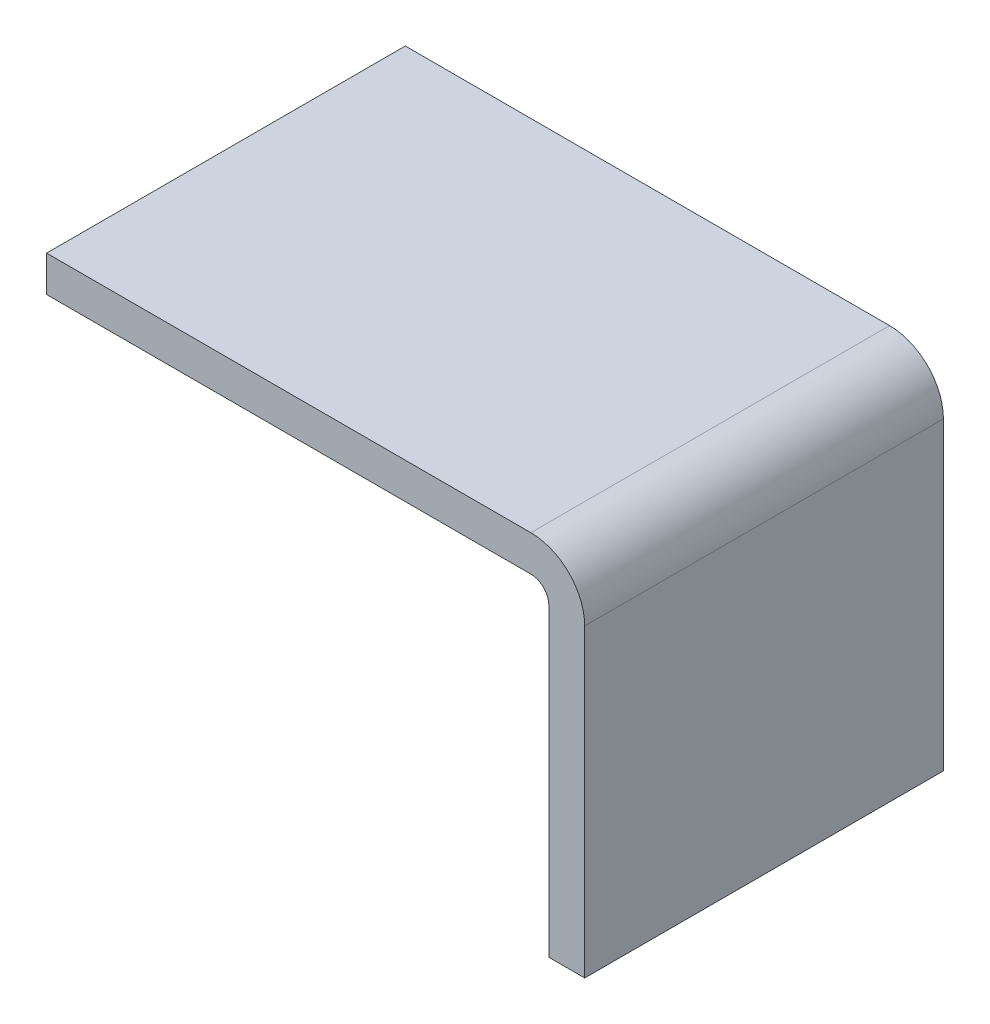
ISO-10303-21;
HEADER;
FILE_DESCRIPTION(('STEP AP214'),'2;1');
FILE_NAME('part.step','',(''),(''),'','','');
FILE_SCHEMA(('AUTOMOTIVE_DESIGN { 1 0 10303 214 1 1 1 1 }'));
ENDSEC;
DATA;
#1=APPLICATION_CONTEXT('core data for automotive mechanical design processes');
#2=APPLICATION_PROTOCOL_DEFINITION('international standard','automotive_design',2000,#1);
#3=PRODUCT_CONTEXT('',#1,'mechanical');
#4=PRODUCT('Part','Part','',(#3));
#5=PRODUCT_RELATED_PRODUCT_CATEGORY('part','',(#4));
#6=PRODUCT_DEFINITION_FORMATION('','',#4);
#7=PRODUCT_DEFINITION_CONTEXT('part definition',#1,'design');
#8=PRODUCT_DEFINITION('design','',#6,#7);
#9=PRODUCT_DEFINITION_SHAPE('','',#8);
#10=(LENGTH_UNIT() NAMED_UNIT(*) SI_UNIT(.MILLI.,.METRE.));
#11=(NAMED_UNIT(*) PLANE_ANGLE_UNIT() SI_UNIT($,.RADIAN.));
#12=(NAMED_UNIT(*) SI_UNIT($,.STERADIAN.) SOLID_ANGLE_UNIT());
#13=UNCERTAINTY_MEASURE_WITH_UNIT(LENGTH_MEASURE(1.E-05),#10,'distance_accuracy_value','');
#14=(GEOMETRIC_REPRESENTATION_CONTEXT(3) GLOBAL_UNCERTAINTY_ASSIGNED_CONTEXT((#13)) GLOBAL_UNIT_ASSIGNED_CONTEXT((#10,
#11,#12)) REPRESENTATION_CONTEXT('',''));
#15=CARTESIAN_POINT('',(0.,0.,0.));
#16=DIRECTION('',(0.,0.,1.));
#17=DIRECTION('',(1.,0.,0.));
#18=AXIS2_PLACEMENT_3D('',#15,#16,#17);
#19=CARTESIAN_POINT('',(0.,0.,0.));
#20=DIRECTION('',(1.,0.,0.));
#21=DIRECTION('',(0.,0.,-1.));
#22=AXIS2_PLACEMENT_3D('',#19,#20,#21);
#23=PLANE('',#22);
#24=DIRECTION('',(0.,0.,-1.));
#25=VECTOR('',#24,1.);
#26=CARTESIAN_POINT('',(0.,127.,-127.));
#27=LINE('',#26,#25);
#28=CARTESIAN_POINT('',(0.,127.,0.));
#29=VERTEX_POINT('',#28);
#30=CARTESIAN_POINT('',(0.,127.,-127.));
#31=VERTEX_POINT('',#30);
#32=EDGE_CURVE('E139',#29,#31,#27,.T.);
#33=ORIENTED_EDGE('',*,*,#32,.T.);
#34=DIRECTION('',(0.,-1.,0.));
#35=VECTOR('',#34,1.);
#36=CARTESIAN_POINT('',(0.,0.,-127.));
#37=LINE('',#36,#35);
#38=CARTESIAN_POINT('',(0.,114.3,-127.));
#39=VERTEX_POINT('',#38);
#40=EDGE_CURVE('E135',#31,#39,#37,.T.);
#41=ORIENTED_EDGE('',*,*,#40,.T.);
#42=DIRECTION('',(0.,0.,1.));
#43=VECTOR('',#42,1.);
#44=CARTESIAN_POINT('',(0.,114.3,-127.));
#45=LINE('',#44,#43);
#46=CARTESIAN_POINT('',(0.,114.3,0.));
#47=VERTEX_POINT('',#46);
#48=EDGE_CURVE('E108',#39,#47,#45,.T.);
#49=ORIENTED_EDGE('',*,*,#48,.T.);
#50=DIRECTION('',(0.,-1.,0.));
#51=VECTOR('',#50,1.);
#52=CARTESIAN_POINT('',(0.,0.,0.));
#53=LINE('',#52,#51);
#54=EDGE_CURVE('E116',#29,#47,#53,.T.);
#55=ORIENTED_EDGE('',*,*,#54,.F.);
#56=EDGE_LOOP('',(#33,#41,#49,#55));
#57=FACE_BOUND('',#56,.T.);
#58=ADVANCED_FACE('F39',(#57),#23,.F.);
#59=CARTESIAN_POINT('',(0.,0.,0.));
#60=DIRECTION('',(0.,1.,0.));
#61=DIRECTION('',(0.,0.,1.));
#62=AXIS2_PLACEMENT_3D('',#59,#60,#61);
#63=PLANE('',#62);
#64=DIRECTION('',(0.,0.,1.));
#65=VECTOR('',#64,1.);
#66=CARTESIAN_POINT('',(190.5,0.,-127.));
#67=LINE('',#66,#65);
#68=CARTESIAN_POINT('',(190.5,0.,-127.));
#69=VERTEX_POINT('',#68);
#70=CARTESIAN_POINT('',(190.5,0.,0.));
#71=VERTEX_POINT('',#70);
#72=EDGE_CURVE('E113',#69,#71,#67,.T.);
#73=ORIENTED_EDGE('',*,*,#72,.T.);
#74=DIRECTION('',(1.,0.,0.));
#75=VECTOR('',#74,1.);
#76=CARTESIAN_POINT('',(0.,0.,0.));
#77=LINE('',#76,#75);
#78=CARTESIAN_POINT('',(177.8,0.,0.));
#79=VERTEX_POINT('',#78);
#80=EDGE_CURVE('E110',#79,#71,#77,.T.);
#81=ORIENTED_EDGE('',*,*,#80,.F.);
#82=DIRECTION('',(0.,0.,-1.));
#83=VECTOR('',#82,1.);
#84=CARTESIAN_POINT('',(177.8,0.,-127.));
#85=LINE('',#84,#83);
#86=CARTESIAN_POINT('',(177.8,0.,-127.));
#87=VERTEX_POINT('',#86);
#88=EDGE_CURVE('E43',#79,#87,#85,.T.);
#89=ORIENTED_EDGE('',*,*,#88,.T.);
#90=DIRECTION('',(1.,0.,0.));
#91=VECTOR('',#90,1.);
#92=CARTESIAN_POINT('',(0.,0.,-127.));
#93=LINE('',#92,#91);
#94=EDGE_CURVE('E138',#87,#69,#93,.T.);
#95=ORIENTED_EDGE('',*,*,#94,.T.);
#96=EDGE_LOOP('',(#73,#81,#89,#95));
#97=FACE_BOUND('',#96,.T.);
#98=ADVANCED_FACE('F111',(#97),#63,.F.);
#99=CARTESIAN_POINT('',(171.45,107.95,-127.));
#100=DIRECTION('',(0.,0.,1.));
#101=DIRECTION('',(1.,0.,0.));
#102=AXIS2_PLACEMENT_3D('',#99,#100,#101);
#103=CYLINDRICAL_SURFACE('',#102,19.05);
#104=CARTESIAN_POINT('',(171.45,107.95,-127.));
#105=DIRECTION('',(0.,0.,-1.));
#106=DIRECTION('',(-1.,0.,0.));
#107=AXIS2_PLACEMENT_3D('',#104,#105,#106);
#108=CIRCLE('',#107,19.05);
#109=CARTESIAN_POINT('',(171.45,127.,-127.));
#110=VERTEX_POINT('',#109);
#111=CARTESIAN_POINT('',(190.5,107.95,-127.));
#112=VERTEX_POINT('',#111);
#113=EDGE_CURVE('E164',#110,#112,#108,.T.);
#114=ORIENTED_EDGE('',*,*,#113,.F.);
#115=DIRECTION('',(0.,0.,1.));
#116=VECTOR('',#115,1.);
#117=CARTESIAN_POINT('',(171.45,127.,-127.));
#118=LINE('',#117,#116);
#119=CARTESIAN_POINT('',(171.45,127.,0.));
#120=VERTEX_POINT('',#119);
#121=EDGE_CURVE('E115',#120,#110,#118,.F.);
#122=ORIENTED_EDGE('',*,*,#121,.F.);
#123=CARTESIAN_POINT('',(171.45,107.95,0.));
#124=DIRECTION('',(0.,0.,-1.));
#125=DIRECTION('',(-1.,0.,0.));
#126=AXIS2_PLACEMENT_3D('',#123,#124,#125);
#127=CIRCLE('',#126,19.05);
#128=CARTESIAN_POINT('',(190.5,107.95,0.));
#129=VERTEX_POINT('',#128);
#130=EDGE_CURVE('E148',#129,#120,#127,.F.);
#131=ORIENTED_EDGE('',*,*,#130,.F.);
#132=DIRECTION('',(0.,0.,1.));
#133=VECTOR('',#132,1.);
#134=CARTESIAN_POINT('',(190.5,107.95,-127.));
#135=LINE('',#134,#133);
#136=EDGE_CURVE('E168',#112,#129,#135,.T.);
#137=ORIENTED_EDGE('',*,*,#136,.F.);
#138=EDGE_LOOP('',(#114,#122,#131,#137));
#139=FACE_BOUND('',#138,.T.);
#140=ADVANCED_FACE('F171',(#139),#103,.T.);
#141=CARTESIAN_POINT('',(0.,0.,-127.));
#142=DIRECTION('',(0.,0.,-1.));
#143=DIRECTION('',(-1.,0.,0.));
#144=AXIS2_PLACEMENT_3D('',#141,#142,#143);
#145=PLANE('',#144);
#146=ORIENTED_EDGE('',*,*,#40,.F.);
#147=DIRECTION('',(-1.,0.,0.));
#148=VECTOR('',#147,1.);
#149=CARTESIAN_POINT('',(-190.5,127.,-127.));
#150=LINE('',#149,#148);
#151=EDGE_CURVE('E144',#110,#31,#150,.T.);
#152=ORIENTED_EDGE('',*,*,#151,.F.);
#153=ORIENTED_EDGE('',*,*,#113,.T.);
#154=DIRECTION('',(0.,1.,0.));
#155=VECTOR('',#154,1.);
#156=CARTESIAN_POINT('',(190.5,-127.,-127.));
#157=LINE('',#156,#155);
#158=EDGE_CURVE('E147',#69,#112,#157,.T.);
#159=ORIENTED_EDGE('',*,*,#158,.F.);
#160=ORIENTED_EDGE('',*,*,#94,.F.);
#161=DIRECTION('',(0.,-1.,0.));
#162=VECTOR('',#161,1.);
#163=CARTESIAN_POINT('',(177.8,107.95,-127.));
#164=LINE('',#163,#162);
#165=CARTESIAN_POINT('',(177.8,107.95,-127.));
#166=VERTEX_POINT('',#165);
#167=EDGE_CURVE('E106',#166,#87,#164,.T.);
#168=ORIENTED_EDGE('',*,*,#167,.F.);
#169=CARTESIAN_POINT('',(171.45,107.95,-127.));
#170=DIRECTION('',(0.,0.,-1.));
#171=DIRECTION('',(-1.,0.,0.));
#172=AXIS2_PLACEMENT_3D('',#169,#170,#171);
#173=CIRCLE('',#172,6.35000000000002);
#174=CARTESIAN_POINT('',(171.45,114.3,-127.));
#175=VERTEX_POINT('',#174);
#176=EDGE_CURVE('E125',#175,#166,#173,.T.);
#177=ORIENTED_EDGE('',*,*,#176,.F.);
#178=DIRECTION('',(1.,0.,0.));
#179=VECTOR('',#178,1.);
#180=CARTESIAN_POINT('',(-158.75,114.3,-127.));
#181=LINE('',#180,#179);
#182=EDGE_CURVE('E121',#39,#175,#181,.T.);
#183=ORIENTED_EDGE('',*,*,#182,.F.);
#184=EDGE_LOOP('',(#146,#152,#153,#159,#160,#168,#177,#183));
#185=FACE_BOUND('',#184,.T.);
#186=ADVANCED_FACE('F161',(#185),#145,.T.);
#187=CARTESIAN_POINT('',(171.45,107.95,-127.));
#188=DIRECTION('',(0.,0.,1.));
#189=DIRECTION('',(1.,0.,0.));
#190=AXIS2_PLACEMENT_3D('',#187,#188,#189);
#191=CYLINDRICAL_SURFACE('',#190,6.35000000000002);
#192=CARTESIAN_POINT('',(171.45,107.95,0.));
#193=DIRECTION('',(0.,0.,-1.));
#194=DIRECTION('',(-1.,0.,0.));
#195=AXIS2_PLACEMENT_3D('',#192,#193,#194);
#196=CIRCLE('',#195,6.35000000000002);
#197=CARTESIAN_POINT('',(171.45,114.3,0.));
#198=VERTEX_POINT('',#197);
#199=CARTESIAN_POINT('',(177.8,107.95,0.));
#200=VERTEX_POINT('',#199);
#201=EDGE_CURVE('E49',#198,#200,#196,.T.);
#202=ORIENTED_EDGE('',*,*,#201,.F.);
#203=DIRECTION('',(0.,0.,1.));
#204=VECTOR('',#203,1.);
#205=CARTESIAN_POINT('',(171.45,114.3,-127.));
#206=LINE('',#205,#204);
#207=EDGE_CURVE('E153',#175,#198,#206,.T.);
#208=ORIENTED_EDGE('',*,*,#207,.F.);
#209=ORIENTED_EDGE('',*,*,#176,.T.);
#210=DIRECTION('',(0.,0.,1.));
#211=VECTOR('',#210,1.);
#212=CARTESIAN_POINT('',(177.8,107.95,-127.));
#213=LINE('',#212,#211);
#214=EDGE_CURVE('E128',#166,#200,#213,.T.);
#215=ORIENTED_EDGE('',*,*,#214,.T.);
#216=EDGE_LOOP('',(#202,#208,#209,#215));
#217=FACE_BOUND('',#216,.T.);
#218=ADVANCED_FACE('F178',(#217),#191,.F.);
#219=CARTESIAN_POINT('',(0.,0.,0.));
#220=DIRECTION('',(0.,0.,-1.));
#221=DIRECTION('',(-1.,0.,0.));
#222=AXIS2_PLACEMENT_3D('',#219,#220,#221);
#223=PLANE('',#222);
#224=DIRECTION('',(-1.,0.,0.));
#225=VECTOR('',#224,1.);
#226=CARTESIAN_POINT('',(-190.5,127.,0.));
#227=LINE('',#226,#225);
#228=EDGE_CURVE('E149',#120,#29,#227,.T.);
#229=ORIENTED_EDGE('',*,*,#228,.T.);
#230=ORIENTED_EDGE('',*,*,#54,.T.);
#231=DIRECTION('',(1.,0.,0.));
#232=VECTOR('',#231,1.);
#233=CARTESIAN_POINT('',(-158.75,114.3,0.));
#234=LINE('',#233,#232);
#235=EDGE_CURVE('E11',#47,#198,#234,.T.);
#236=ORIENTED_EDGE('',*,*,#235,.T.);
#237=ORIENTED_EDGE('',*,*,#201,.T.);
#238=DIRECTION('',(0.,-1.,0.));
#239=VECTOR('',#238,1.);
#240=CARTESIAN_POINT('',(177.8,107.95,0.));
#241=LINE('',#240,#239);
#242=EDGE_CURVE('E104',#200,#79,#241,.T.);
#243=ORIENTED_EDGE('',*,*,#242,.T.);
#244=ORIENTED_EDGE('',*,*,#80,.T.);
#245=DIRECTION('',(0.,1.,0.));
#246=VECTOR('',#245,1.);
#247=CARTESIAN_POINT('',(190.5,-127.,0.));
#248=LINE('',#247,#246);
#249=EDGE_CURVE('E150',#71,#129,#248,.T.);
#250=ORIENTED_EDGE('',*,*,#249,.T.);
#251=ORIENTED_EDGE('',*,*,#130,.T.);
#252=EDGE_LOOP('',(#229,#230,#236,#237,#243,#244,#250,#251));
#253=FACE_BOUND('',#252,.T.);
#254=ADVANCED_FACE('F119',(#253),#223,.F.);
#255=CARTESIAN_POINT('',(177.8,107.95,-127.));
#256=DIRECTION('',(-1.,0.,0.));
#257=DIRECTION('',(0.,0.,1.));
#258=AXIS2_PLACEMENT_3D('',#255,#256,#257);
#259=PLANE('',#258);
#260=ORIENTED_EDGE('',*,*,#88,.F.);
#261=ORIENTED_EDGE('',*,*,#242,.F.);
#262=ORIENTED_EDGE('',*,*,#214,.F.);
#263=ORIENTED_EDGE('',*,*,#167,.T.);
#264=EDGE_LOOP('',(#260,#261,#262,#263));
#265=FACE_BOUND('',#264,.T.);
#266=ADVANCED_FACE('F102',(#265),#259,.T.);
#267=CARTESIAN_POINT('',(-158.75,114.3,-127.));
#268=DIRECTION('',(0.,-1.,0.));
#269=DIRECTION('',(0.,0.,-1.));
#270=AXIS2_PLACEMENT_3D('',#267,#268,#269);
#271=PLANE('',#270);
#272=ORIENTED_EDGE('',*,*,#48,.F.);
#273=ORIENTED_EDGE('',*,*,#182,.T.);
#274=ORIENTED_EDGE('',*,*,#207,.T.);
#275=ORIENTED_EDGE('',*,*,#235,.F.);
#276=EDGE_LOOP('',(#272,#273,#274,#275));
#277=FACE_BOUND('',#276,.T.);
#278=ADVANCED_FACE('F41',(#277),#271,.T.);
#279=CARTESIAN_POINT('',(-190.5,127.,-127.));
#280=DIRECTION('',(0.,1.,0.));
#281=DIRECTION('',(0.,0.,1.));
#282=AXIS2_PLACEMENT_3D('',#279,#280,#281);
#283=PLANE('',#282);
#284=ORIENTED_EDGE('',*,*,#32,.F.);
#285=ORIENTED_EDGE('',*,*,#228,.F.);
#286=ORIENTED_EDGE('',*,*,#121,.T.);
#287=ORIENTED_EDGE('',*,*,#151,.T.);
#288=EDGE_LOOP('',(#284,#285,#286,#287));
#289=FACE_BOUND('',#288,.T.);
#290=ADVANCED_FACE('F185',(#289),#283,.T.);
#291=CARTESIAN_POINT('',(190.5,-127.,-127.));
#292=DIRECTION('',(1.,0.,0.));
#293=DIRECTION('',(0.,0.,-1.));
#294=AXIS2_PLACEMENT_3D('',#291,#292,#293);
#295=PLANE('',#294);
#296=ORIENTED_EDGE('',*,*,#72,.F.);
#297=ORIENTED_EDGE('',*,*,#158,.T.);
#298=ORIENTED_EDGE('',*,*,#136,.T.);
#299=ORIENTED_EDGE('',*,*,#249,.F.);
#300=EDGE_LOOP('',(#296,#297,#298,#299));
#301=FACE_BOUND('',#300,.T.);
#302=ADVANCED_FACE('F158',(#301),#295,.T.);
#303=CLOSED_SHELL('',(#58,#98,#140,#186,#218,#254,#266,#278,#290,#302));
#304=MANIFOLD_SOLID_BREP('B2',#303);
#305=ADVANCED_BREP_SHAPE_REPRESENTATION('',(#18,#304),#14);
#306=SHAPE_DEFINITION_REPRESENTATION(#9,#305);
ENDSEC;
END-ISO-10303-21;
